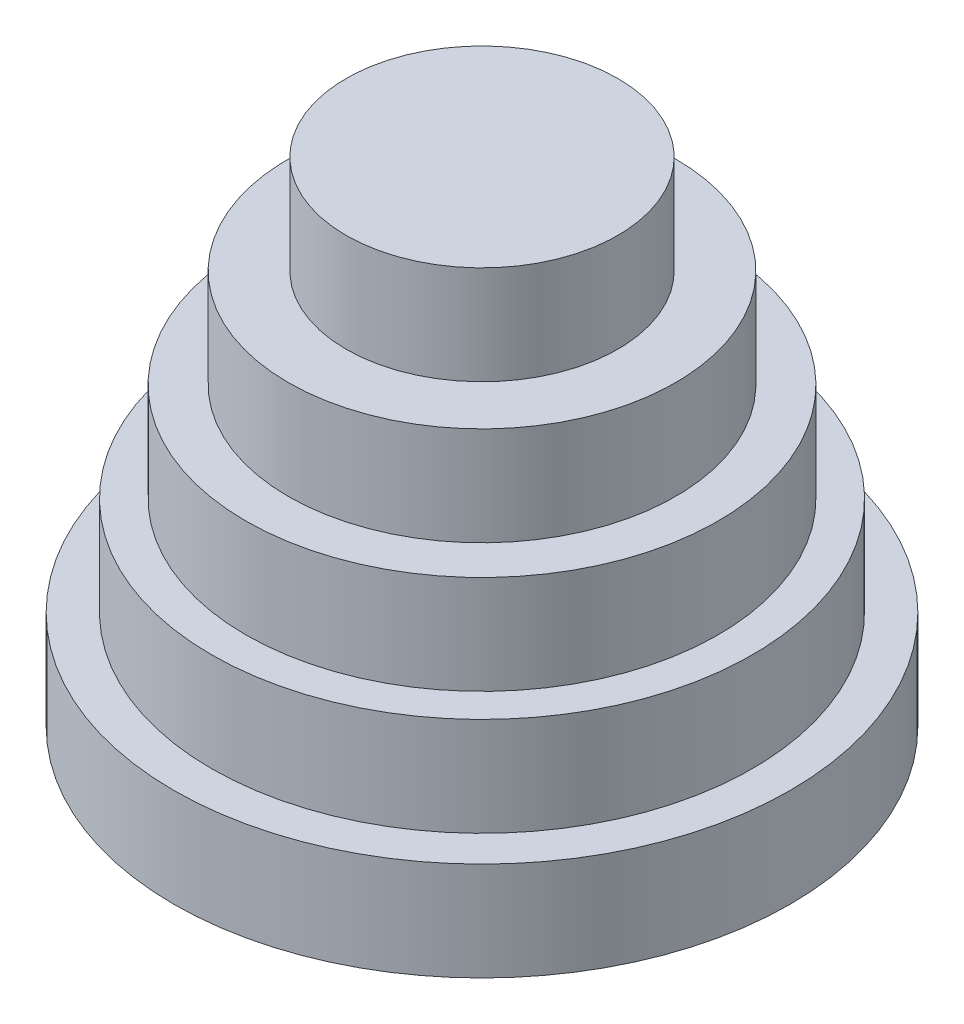
ISO-10303-21;
HEADER;
FILE_DESCRIPTION(('STEP AP214'),'2;1');
FILE_NAME('part.step','',(''),(''),'','','');
FILE_SCHEMA(('AUTOMOTIVE_DESIGN { 1 0 10303 214 1 1 1 1 }'));
ENDSEC;
DATA;
#1=APPLICATION_CONTEXT('core data for automotive mechanical design processes');
#2=APPLICATION_PROTOCOL_DEFINITION('international standard','automotive_design',2000,#1);
#3=PRODUCT_CONTEXT('',#1,'mechanical');
#4=PRODUCT('Part','Part','',(#3));
#5=PRODUCT_RELATED_PRODUCT_CATEGORY('part','',(#4));
#6=PRODUCT_DEFINITION_FORMATION('','',#4);
#7=PRODUCT_DEFINITION_CONTEXT('part definition',#1,'design');
#8=PRODUCT_DEFINITION('design','',#6,#7);
#9=PRODUCT_DEFINITION_SHAPE('','',#8);
#10=(LENGTH_UNIT() NAMED_UNIT(*) SI_UNIT(.MILLI.,.METRE.));
#11=(NAMED_UNIT(*) PLANE_ANGLE_UNIT() SI_UNIT($,.RADIAN.));
#12=(NAMED_UNIT(*) SI_UNIT($,.STERADIAN.) SOLID_ANGLE_UNIT());
#13=UNCERTAINTY_MEASURE_WITH_UNIT(LENGTH_MEASURE(1.E-05),#10,'distance_accuracy_value','');
#14=(GEOMETRIC_REPRESENTATION_CONTEXT(3) GLOBAL_UNCERTAINTY_ASSIGNED_CONTEXT((#13)) GLOBAL_UNIT_ASSIGNED_CONTEXT((#10,
#11,#12)) REPRESENTATION_CONTEXT('',''));
#15=CARTESIAN_POINT('',(0.,0.,0.));
#16=DIRECTION('',(0.,0.,1.));
#17=DIRECTION('',(1.,0.,0.));
#18=AXIS2_PLACEMENT_3D('',#15,#16,#17);
#19=CARTESIAN_POINT('',(0.,40.,0.));
#20=DIRECTION('',(0.,1.,0.));
#21=DIRECTION('',(0.,0.,1.));
#22=AXIS2_PLACEMENT_3D('',#19,#20,#21);
#23=CYLINDRICAL_SURFACE('',#22,25.);
#24=CARTESIAN_POINT('',(0.,0.,0.));
#25=DIRECTION('',(0.,1.,0.));
#26=DIRECTION('',(0.,0.,1.));
#27=AXIS2_PLACEMENT_3D('',#24,#25,#26);
#28=CIRCLE('',#27,25.);
#29=CARTESIAN_POINT('',(0.,0.,25.));
#30=VERTEX_POINT('',#29);
#31=EDGE_CURVE('E84',#30,#30,#28,.T.);
#32=ORIENTED_EDGE('',*,*,#31,.T.);
#33=EDGE_LOOP('',(#32));
#34=FACE_BOUND('',#33,.T.);
#35=CARTESIAN_POINT('',(0.,8.,0.));
#36=DIRECTION('',(0.,1.,0.));
#37=DIRECTION('',(0.,0.,1.));
#38=AXIS2_PLACEMENT_3D('',#35,#36,#37);
#39=CIRCLE('',#38,25.);
#40=CARTESIAN_POINT('',(0.,8.,25.));
#41=VERTEX_POINT('',#40);
#42=EDGE_CURVE('E10',#41,#41,#39,.T.);
#43=ORIENTED_EDGE('',*,*,#42,.F.);
#44=EDGE_LOOP('',(#43));
#45=FACE_BOUND('',#44,.T.);
#46=ADVANCED_FACE('F41',(#34,#45),#23,.T.);
#47=CARTESIAN_POINT('',(-25.,8.,0.));
#48=DIRECTION('',(0.,1.,0.));
#49=DIRECTION('',(0.,0.,1.));
#50=AXIS2_PLACEMENT_3D('',#47,#48,#49);
#51=PLANE('',#50);
#52=ORIENTED_EDGE('',*,*,#42,.T.);
#53=EDGE_LOOP('',(#52));
#54=FACE_BOUND('',#53,.T.);
#55=CARTESIAN_POINT('',(0.,8.,0.));
#56=DIRECTION('',(0.,1.,0.));
#57=DIRECTION('',(0.,0.,1.));
#58=AXIS2_PLACEMENT_3D('',#55,#56,#57);
#59=CIRCLE('',#58,21.9421764391989);
#60=CARTESIAN_POINT('',(0.,8.,21.9421764391989));
#61=VERTEX_POINT('',#60);
#62=EDGE_CURVE('E48',#61,#61,#59,.T.);
#63=ORIENTED_EDGE('',*,*,#62,.F.);
#64=EDGE_LOOP('',(#63));
#65=FACE_BOUND('',#64,.T.);
#66=ADVANCED_FACE('F102',(#54,#65),#51,.T.);
#67=CARTESIAN_POINT('',(0.,40.,0.));
#68=DIRECTION('',(0.,1.,0.));
#69=DIRECTION('',(0.,0.,1.));
#70=AXIS2_PLACEMENT_3D('',#67,#68,#69);
#71=CYLINDRICAL_SURFACE('',#70,21.9421764391989);
#72=ORIENTED_EDGE('',*,*,#62,.T.);
#73=EDGE_LOOP('',(#72));
#74=FACE_BOUND('',#73,.T.);
#75=CARTESIAN_POINT('',(0.,16.,0.));
#76=DIRECTION('',(0.,1.,0.));
#77=DIRECTION('',(0.,0.,1.));
#78=AXIS2_PLACEMENT_3D('',#75,#76,#77);
#79=CIRCLE('',#78,21.9421764391989);
#80=CARTESIAN_POINT('',(0.,16.,21.9421764391989));
#81=VERTEX_POINT('',#80);
#82=EDGE_CURVE('E53',#81,#81,#79,.T.);
#83=ORIENTED_EDGE('',*,*,#82,.F.);
#84=EDGE_LOOP('',(#83));
#85=FACE_BOUND('',#84,.T.);
#86=ADVANCED_FACE('F106',(#74,#85),#71,.T.);
#87=CARTESIAN_POINT('',(-21.9421764391989,16.,0.));
#88=DIRECTION('',(0.,1.,0.));
#89=DIRECTION('',(0.,0.,1.));
#90=AXIS2_PLACEMENT_3D('',#87,#88,#89);
#91=PLANE('',#90);
#92=ORIENTED_EDGE('',*,*,#82,.T.);
#93=EDGE_LOOP('',(#92));
#94=FACE_BOUND('',#93,.T.);
#95=CARTESIAN_POINT('',(0.,16.,0.));
#96=DIRECTION('',(0.,1.,0.));
#97=DIRECTION('',(0.,0.,1.));
#98=AXIS2_PLACEMENT_3D('',#95,#96,#97);
#99=CIRCLE('',#98,19.1541766900685);
#100=CARTESIAN_POINT('',(0.,16.,19.1541766900685));
#101=VERTEX_POINT('',#100);
#102=EDGE_CURVE('E58',#101,#101,#99,.T.);
#103=ORIENTED_EDGE('',*,*,#102,.F.);
#104=EDGE_LOOP('',(#103));
#105=FACE_BOUND('',#104,.T.);
#106=ADVANCED_FACE('F110',(#94,#105),#91,.T.);
#107=CARTESIAN_POINT('',(0.,40.,0.));
#108=DIRECTION('',(0.,1.,0.));
#109=DIRECTION('',(0.,0.,1.));
#110=AXIS2_PLACEMENT_3D('',#107,#108,#109);
#111=CYLINDRICAL_SURFACE('',#110,19.1541766900685);
#112=ORIENTED_EDGE('',*,*,#102,.T.);
#113=EDGE_LOOP('',(#112));
#114=FACE_BOUND('',#113,.T.);
#115=CARTESIAN_POINT('',(0.,24.,0.));
#116=DIRECTION('',(0.,1.,0.));
#117=DIRECTION('',(0.,0.,1.));
#118=AXIS2_PLACEMENT_3D('',#115,#116,#117);
#119=CIRCLE('',#118,19.1541766900685);
#120=CARTESIAN_POINT('',(0.,24.,19.1541766900685));
#121=VERTEX_POINT('',#120);
#122=EDGE_CURVE('E64',#121,#121,#119,.T.);
#123=ORIENTED_EDGE('',*,*,#122,.F.);
#124=EDGE_LOOP('',(#123));
#125=FACE_BOUND('',#124,.T.);
#126=ADVANCED_FACE('F116',(#114,#125),#111,.T.);
#127=CARTESIAN_POINT('',(-19.1541766900685,24.,0.));
#128=DIRECTION('',(0.,1.,0.));
#129=DIRECTION('',(0.,0.,1.));
#130=AXIS2_PLACEMENT_3D('',#127,#128,#129);
#131=PLANE('',#130);
#132=ORIENTED_EDGE('',*,*,#122,.T.);
#133=EDGE_LOOP('',(#132));
#134=FACE_BOUND('',#133,.T.);
#135=CARTESIAN_POINT('',(0.,24.,0.));
#136=DIRECTION('',(0.,1.,0.));
#137=DIRECTION('',(0.,0.,1.));
#138=AXIS2_PLACEMENT_3D('',#135,#136,#137);
#139=CIRCLE('',#138,15.7077504344161);
#140=CARTESIAN_POINT('',(0.,24.,15.7077504344161));
#141=VERTEX_POINT('',#140);
#142=EDGE_CURVE('E68',#141,#141,#139,.T.);
#143=ORIENTED_EDGE('',*,*,#142,.F.);
#144=EDGE_LOOP('',(#143));
#145=FACE_BOUND('',#144,.T.);
#146=ADVANCED_FACE('F120',(#134,#145),#131,.T.);
#147=CARTESIAN_POINT('',(0.,40.,0.));
#148=DIRECTION('',(0.,1.,0.));
#149=DIRECTION('',(0.,0.,1.));
#150=AXIS2_PLACEMENT_3D('',#147,#148,#149);
#151=CYLINDRICAL_SURFACE('',#150,15.7077504344161);
#152=ORIENTED_EDGE('',*,*,#142,.T.);
#153=EDGE_LOOP('',(#152));
#154=FACE_BOUND('',#153,.T.);
#155=CARTESIAN_POINT('',(0.,32.,0.));
#156=DIRECTION('',(0.,1.,0.));
#157=DIRECTION('',(0.,0.,1.));
#158=AXIS2_PLACEMENT_3D('',#155,#156,#157);
#159=CIRCLE('',#158,15.7077504344161);
#160=CARTESIAN_POINT('',(0.,32.,15.7077504344161));
#161=VERTEX_POINT('',#160);
#162=EDGE_CURVE('E72',#161,#161,#159,.T.);
#163=ORIENTED_EDGE('',*,*,#162,.F.);
#164=EDGE_LOOP('',(#163));
#165=FACE_BOUND('',#164,.T.);
#166=ADVANCED_FACE('F124',(#154,#165),#151,.T.);
#167=CARTESIAN_POINT('',(-15.7077504344161,32.,0.));
#168=DIRECTION('',(0.,1.,0.));
#169=DIRECTION('',(0.,0.,1.));
#170=AXIS2_PLACEMENT_3D('',#167,#168,#169);
#171=PLANE('',#170);
#172=ORIENTED_EDGE('',*,*,#162,.T.);
#173=EDGE_LOOP('',(#172));
#174=FACE_BOUND('',#173,.T.);
#175=CARTESIAN_POINT('',(0.,32.,0.));
#176=DIRECTION('',(0.,1.,0.));
#177=DIRECTION('',(0.,0.,1.));
#178=AXIS2_PLACEMENT_3D('',#175,#176,#177);
#179=CIRCLE('',#178,11.0243747788132);
#180=CARTESIAN_POINT('',(0.,32.,11.0243747788132));
#181=VERTEX_POINT('',#180);
#182=EDGE_CURVE('E76',#181,#181,#179,.T.);
#183=ORIENTED_EDGE('',*,*,#182,.F.);
#184=EDGE_LOOP('',(#183));
#185=FACE_BOUND('',#184,.T.);
#186=ADVANCED_FACE('F128',(#174,#185),#171,.T.);
#187=CARTESIAN_POINT('',(0.,40.,0.));
#188=DIRECTION('',(0.,1.,0.));
#189=DIRECTION('',(0.,0.,1.));
#190=AXIS2_PLACEMENT_3D('',#187,#188,#189);
#191=CYLINDRICAL_SURFACE('',#190,11.0243747788132);
#192=ORIENTED_EDGE('',*,*,#182,.T.);
#193=EDGE_LOOP('',(#192));
#194=FACE_BOUND('',#193,.T.);
#195=CARTESIAN_POINT('',(0.,40.,0.));
#196=DIRECTION('',(0.,1.,0.));
#197=DIRECTION('',(0.,0.,1.));
#198=AXIS2_PLACEMENT_3D('',#195,#196,#197);
#199=CIRCLE('',#198,11.0243747788132);
#200=CARTESIAN_POINT('',(0.,40.,11.0243747788132));
#201=VERTEX_POINT('',#200);
#202=EDGE_CURVE('E80',#201,#201,#199,.T.);
#203=ORIENTED_EDGE('',*,*,#202,.F.);
#204=EDGE_LOOP('',(#203));
#205=FACE_BOUND('',#204,.T.);
#206=ADVANCED_FACE('F98',(#194,#205),#191,.T.);
#207=CARTESIAN_POINT('',(-11.0243747788132,40.,0.));
#208=DIRECTION('',(0.,1.,0.));
#209=DIRECTION('',(0.,0.,1.));
#210=AXIS2_PLACEMENT_3D('',#207,#208,#209);
#211=PLANE('',#210);
#212=ORIENTED_EDGE('',*,*,#202,.T.);
#213=EDGE_LOOP('',(#212));
#214=FACE_BOUND('',#213,.T.);
#215=ADVANCED_FACE('F93',(#214),#211,.T.);
#216=CARTESIAN_POINT('',(0.,0.,0.));
#217=DIRECTION('',(0.,-1.,0.));
#218=DIRECTION('',(0.,0.,-1.));
#219=AXIS2_PLACEMENT_3D('',#216,#217,#218);
#220=PLANE('',#219);
#221=ORIENTED_EDGE('',*,*,#31,.F.);
#222=EDGE_LOOP('',(#221));
#223=FACE_BOUND('',#222,.T.);
#224=ADVANCED_FACE('F91',(#223),#220,.T.);
#225=CLOSED_SHELL('',(#46,#66,#86,#106,#126,#146,#166,#186,#206,#215,#224));
#226=MANIFOLD_SOLID_BREP('B2',#225);
#227=ADVANCED_BREP_SHAPE_REPRESENTATION('',(#18,#226),#14);
#228=SHAPE_DEFINITION_REPRESENTATION(#9,#227);
ENDSEC;
END-ISO-10303-21;
